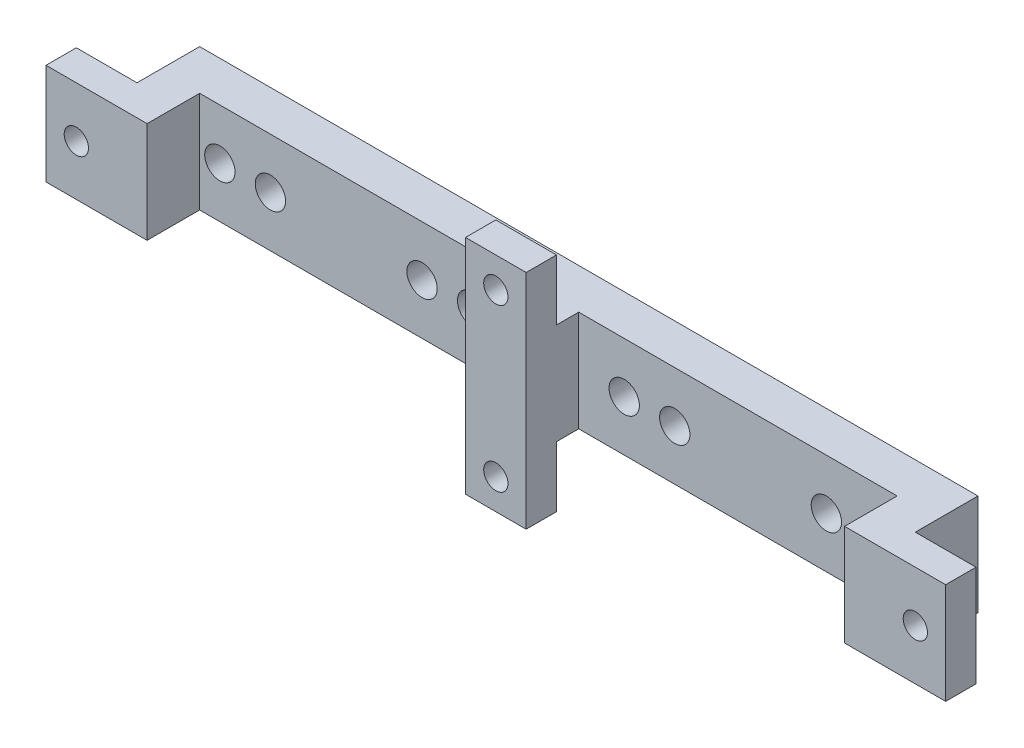
ISO-10303-21;
HEADER;
FILE_DESCRIPTION(('STEP AP214'),'2;1');
FILE_NAME('part.step','',(''),(''),'','','');
FILE_SCHEMA(('AUTOMOTIVE_DESIGN { 1 0 10303 214 1 1 1 1 }'));
ENDSEC;
DATA;
#1=APPLICATION_CONTEXT('core data for automotive mechanical design processes');
#2=APPLICATION_PROTOCOL_DEFINITION('international standard','automotive_design',2000,#1);
#3=PRODUCT_CONTEXT('',#1,'mechanical');
#4=PRODUCT('Part','Part','',(#3));
#5=PRODUCT_RELATED_PRODUCT_CATEGORY('part','',(#4));
#6=PRODUCT_DEFINITION_FORMATION('','',#4);
#7=PRODUCT_DEFINITION_CONTEXT('part definition',#1,'design');
#8=PRODUCT_DEFINITION('design','',#6,#7);
#9=PRODUCT_DEFINITION_SHAPE('','',#8);
#10=(LENGTH_UNIT() NAMED_UNIT(*) SI_UNIT(.MILLI.,.METRE.));
#11=(NAMED_UNIT(*) PLANE_ANGLE_UNIT() SI_UNIT($,.RADIAN.));
#12=(NAMED_UNIT(*) SI_UNIT($,.STERADIAN.) SOLID_ANGLE_UNIT());
#13=UNCERTAINTY_MEASURE_WITH_UNIT(LENGTH_MEASURE(1.E-05),#10,'distance_accuracy_value','');
#14=(GEOMETRIC_REPRESENTATION_CONTEXT(3) GLOBAL_UNCERTAINTY_ASSIGNED_CONTEXT((#13)) GLOBAL_UNIT_ASSIGNED_CONTEXT((#10,
#11,#12)) REPRESENTATION_CONTEXT('',''));
#15=CARTESIAN_POINT('',(0.,0.,0.));
#16=DIRECTION('',(0.,0.,1.));
#17=DIRECTION('',(1.,0.,0.));
#18=AXIS2_PLACEMENT_3D('',#15,#16,#17);
#19=CARTESIAN_POINT('',(0.,0.,2.));
#20=DIRECTION('',(0.,0.,1.));
#21=DIRECTION('',(1.,0.,0.));
#22=AXIS2_PLACEMENT_3D('',#19,#20,#21);
#23=PLANE('',#22);
#24=CARTESIAN_POINT('',(-3.74999999999999,0.,2.));
#25=DIRECTION('',(0.,0.,1.));
#26=DIRECTION('',(1.,0.,0.));
#27=AXIS2_PLACEMENT_3D('',#24,#25,#26);
#28=CIRCLE('',#27,0.75);
#29=CARTESIAN_POINT('',(-2.99999999999999,0.,2.));
#30=VERTEX_POINT('',#29);
#31=EDGE_CURVE('E422',#30,#30,#28,.T.);
#32=ORIENTED_EDGE('',*,*,#31,.F.);
#33=EDGE_LOOP('',(#32));
#34=FACE_BOUND('',#33,.T.);
#35=CARTESIAN_POINT('',(-6.24999999999999,0.,2.));
#36=DIRECTION('',(0.,0.,1.));
#37=DIRECTION('',(1.,0.,0.));
#38=AXIS2_PLACEMENT_3D('',#35,#36,#37);
#39=CIRCLE('',#38,0.749999999999999);
#40=CARTESIAN_POINT('',(-5.49999999999999,0.,2.));
#41=VERTEX_POINT('',#40);
#42=EDGE_CURVE('E416',#41,#41,#39,.T.);
#43=ORIENTED_EDGE('',*,*,#42,.F.);
#44=EDGE_LOOP('',(#43));
#45=FACE_BOUND('',#44,.T.);
#46=CARTESIAN_POINT('',(-13.75,0.,2.));
#47=DIRECTION('',(0.,0.,1.));
#48=DIRECTION('',(1.,0.,0.));
#49=AXIS2_PLACEMENT_3D('',#46,#47,#48);
#50=CIRCLE('',#49,0.75);
#51=CARTESIAN_POINT('',(-13.,0.,2.));
#52=VERTEX_POINT('',#51);
#53=EDGE_CURVE('E410',#52,#52,#50,.T.);
#54=ORIENTED_EDGE('',*,*,#53,.F.);
#55=EDGE_LOOP('',(#54));
#56=FACE_BOUND('',#55,.T.);
#57=CARTESIAN_POINT('',(-16.25,0.,2.));
#58=DIRECTION('',(0.,0.,1.));
#59=DIRECTION('',(1.,0.,0.));
#60=AXIS2_PLACEMENT_3D('',#57,#58,#59);
#61=CIRCLE('',#60,0.750000000000002);
#62=CARTESIAN_POINT('',(-15.5,0.,2.));
#63=VERTEX_POINT('',#62);
#64=EDGE_CURVE('E400',#63,#63,#61,.T.);
#65=ORIENTED_EDGE('',*,*,#64,.F.);
#66=EDGE_LOOP('',(#65));
#67=FACE_BOUND('',#66,.T.);
#68=DIRECTION('',(1.,0.,0.));
#69=VECTOR('',#68,1.);
#70=CARTESIAN_POINT('',(-17.25,-2.5,2.));
#71=LINE('',#70,#69);
#72=CARTESIAN_POINT('',(-17.25,-2.5,2.));
#73=VERTEX_POINT('',#72);
#74=CARTESIAN_POINT('',(-1.5,-2.5,2.));
#75=VERTEX_POINT('',#74);
#76=EDGE_CURVE('E452',#73,#75,#71,.T.);
#77=ORIENTED_EDGE('',*,*,#76,.T.);
#78=DIRECTION('',(0.,1.,0.));
#79=VECTOR('',#78,1.);
#80=CARTESIAN_POINT('',(-1.5,0.,2.));
#81=LINE('',#80,#79);
#82=CARTESIAN_POINT('',(-1.5,2.5,2.));
#83=VERTEX_POINT('',#82);
#84=EDGE_CURVE('E361',#75,#83,#81,.T.);
#85=ORIENTED_EDGE('',*,*,#84,.T.);
#86=DIRECTION('',(1.,0.,0.));
#87=VECTOR('',#86,1.);
#88=CARTESIAN_POINT('',(-17.25,2.5,2.));
#89=LINE('',#88,#87);
#90=CARTESIAN_POINT('',(-17.25,2.5,2.));
#91=VERTEX_POINT('',#90);
#92=EDGE_CURVE('E12',#91,#83,#89,.T.);
#93=ORIENTED_EDGE('',*,*,#92,.F.);
#94=DIRECTION('',(0.,-1.,0.));
#95=VECTOR('',#94,1.);
#96=CARTESIAN_POINT('',(-17.25,2.5,2.));
#97=LINE('',#96,#95);
#98=EDGE_CURVE('E448',#91,#73,#97,.T.);
#99=ORIENTED_EDGE('',*,*,#98,.T.);
#100=EDGE_LOOP('',(#77,#85,#93,#99));
#101=FACE_BOUND('',#100,.T.);
#102=ADVANCED_FACE('F101',(#34,#45,#56,#67,#101),#23,.T.);
#103=CARTESIAN_POINT('',(-17.25,-2.5,2.));
#104=DIRECTION('',(0.,1.,0.));
#105=DIRECTION('',(0.,0.,1.));
#106=AXIS2_PLACEMENT_3D('',#103,#104,#105);
#107=PLANE('',#106);
#108=DIRECTION('',(0.,0.,-1.));
#109=VECTOR('',#108,1.);
#110=CARTESIAN_POINT('',(1.5,-2.5,4.6));
#111=LINE('',#110,#109);
#112=CARTESIAN_POINT('',(1.5,-2.5,3.1));
#113=VERTEX_POINT('',#112);
#114=CARTESIAN_POINT('',(1.5,-2.5,2.));
#115=VERTEX_POINT('',#114);
#116=EDGE_CURVE('E353',#113,#115,#111,.T.);
#117=ORIENTED_EDGE('',*,*,#116,.F.);
#118=DIRECTION('',(-1.,0.,0.));
#119=VECTOR('',#118,1.);
#120=CARTESIAN_POINT('',(0.,-2.5,3.1));
#121=LINE('',#120,#119);
#122=CARTESIAN_POINT('',(-1.5,-2.5,3.1));
#123=VERTEX_POINT('',#122);
#124=EDGE_CURVE('E285',#113,#123,#121,.T.);
#125=ORIENTED_EDGE('',*,*,#124,.T.);
#126=DIRECTION('',(0.,0.,-1.));
#127=VECTOR('',#126,1.);
#128=CARTESIAN_POINT('',(-1.5,-2.5,4.6));
#129=LINE('',#128,#127);
#130=EDGE_CURVE('E355',#123,#75,#129,.T.);
#131=ORIENTED_EDGE('',*,*,#130,.T.);
#132=ORIENTED_EDGE('',*,*,#76,.F.);
#133=DIRECTION('',(0.,0.,-1.));
#134=VECTOR('',#133,1.);
#135=CARTESIAN_POINT('',(-17.25,-2.5,4.6));
#136=LINE('',#135,#134);
#137=CARTESIAN_POINT('',(-17.25,-2.5,4.6));
#138=VERTEX_POINT('',#137);
#139=EDGE_CURVE('E393',#138,#73,#136,.T.);
#140=ORIENTED_EDGE('',*,*,#139,.F.);
#141=DIRECTION('',(-1.,0.,0.));
#142=VECTOR('',#141,1.);
#143=CARTESIAN_POINT('',(0.,-2.5,4.6));
#144=LINE('',#143,#142);
#145=CARTESIAN_POINT('',(-22.25,-2.5,4.6));
#146=VERTEX_POINT('',#145);
#147=EDGE_CURVE('E383',#138,#146,#144,.T.);
#148=ORIENTED_EDGE('',*,*,#147,.T.);
#149=DIRECTION('',(0.,0.,1.));
#150=VECTOR('',#149,1.);
#151=CARTESIAN_POINT('',(-22.25,-2.5,3.1));
#152=LINE('',#151,#150);
#153=CARTESIAN_POINT('',(-22.25,-2.5,3.1));
#154=VERTEX_POINT('',#153);
#155=EDGE_CURVE('E344',#154,#146,#152,.T.);
#156=ORIENTED_EDGE('',*,*,#155,.F.);
#157=DIRECTION('',(1.,0.,0.));
#158=VECTOR('',#157,1.);
#159=CARTESIAN_POINT('',(0.,-2.5,3.1));
#160=LINE('',#159,#158);
#161=CARTESIAN_POINT('',(-19.25,-2.5,3.1));
#162=VERTEX_POINT('',#161);
#163=EDGE_CURVE('E331',#154,#162,#160,.T.);
#164=ORIENTED_EDGE('',*,*,#163,.T.);
#165=DIRECTION('',(0.,0.,-1.));
#166=VECTOR('',#165,1.);
#167=CARTESIAN_POINT('',(-19.25,-2.5,4.6));
#168=LINE('',#167,#166);
#169=CARTESIAN_POINT('',(-19.25,-2.5,0.));
#170=VERTEX_POINT('',#169);
#171=EDGE_CURVE('E395',#162,#170,#168,.T.);
#172=ORIENTED_EDGE('',*,*,#171,.T.);
#173=DIRECTION('',(1.,0.,0.));
#174=VECTOR('',#173,1.);
#175=CARTESIAN_POINT('',(-17.25,-2.5,0.));
#176=LINE('',#175,#174);
#177=CARTESIAN_POINT('',(19.25,-2.5,0.));
#178=VERTEX_POINT('',#177);
#179=EDGE_CURVE('E403',#170,#178,#176,.T.);
#180=ORIENTED_EDGE('',*,*,#179,.T.);
#181=DIRECTION('',(0.,0.,-1.));
#182=VECTOR('',#181,1.);
#183=CARTESIAN_POINT('',(19.25,-2.5,4.6));
#184=LINE('',#183,#182);
#185=CARTESIAN_POINT('',(19.25,-2.5,3.1));
#186=VERTEX_POINT('',#185);
#187=EDGE_CURVE('E373',#186,#178,#184,.T.);
#188=ORIENTED_EDGE('',*,*,#187,.F.);
#189=DIRECTION('',(-1.,0.,0.));
#190=VECTOR('',#189,1.);
#191=CARTESIAN_POINT('',(0.,-2.5,3.1));
#192=LINE('',#191,#190);
#193=CARTESIAN_POINT('',(22.25,-2.5,3.1));
#194=VERTEX_POINT('',#193);
#195=EDGE_CURVE('E257',#194,#186,#192,.T.);
#196=ORIENTED_EDGE('',*,*,#195,.F.);
#197=DIRECTION('',(0.,0.,1.));
#198=VECTOR('',#197,1.);
#199=CARTESIAN_POINT('',(22.25,-2.5,3.1));
#200=LINE('',#199,#198);
#201=CARTESIAN_POINT('',(22.25,-2.5,4.6));
#202=VERTEX_POINT('',#201);
#203=EDGE_CURVE('E264',#194,#202,#200,.T.);
#204=ORIENTED_EDGE('',*,*,#203,.T.);
#205=DIRECTION('',(1.,0.,0.));
#206=VECTOR('',#205,1.);
#207=CARTESIAN_POINT('',(0.,-2.5,4.6));
#208=LINE('',#207,#206);
#209=CARTESIAN_POINT('',(17.25,-2.5,4.6));
#210=VERTEX_POINT('',#209);
#211=EDGE_CURVE('E371',#210,#202,#208,.T.);
#212=ORIENTED_EDGE('',*,*,#211,.F.);
#213=DIRECTION('',(0.,0.,-1.));
#214=VECTOR('',#213,1.);
#215=CARTESIAN_POINT('',(17.25,-2.5,4.6));
#216=LINE('',#215,#214);
#217=CARTESIAN_POINT('',(17.25,-2.5,2.));
#218=VERTEX_POINT('',#217);
#219=EDGE_CURVE('E376',#210,#218,#216,.T.);
#220=ORIENTED_EDGE('',*,*,#219,.T.);
#221=EDGE_CURVE('E451',#115,#218,#71,.T.);
#222=ORIENTED_EDGE('',*,*,#221,.F.);
#223=EDGE_LOOP('',(#117,#125,#131,#132,#140,#148,#156,#164,#172,#180,#188,#196,#204,#212,#220,#222));
#224=FACE_BOUND('',#223,.T.);
#225=ADVANCED_FACE('F103',(#224),#107,.F.);
#226=CARTESIAN_POINT('',(-17.25,2.5,2.));
#227=DIRECTION('',(0.,1.,0.));
#228=DIRECTION('',(0.,0.,1.));
#229=AXIS2_PLACEMENT_3D('',#226,#227,#228);
#230=PLANE('',#229);
#231=DIRECTION('',(-1.,0.,0.));
#232=VECTOR('',#231,1.);
#233=CARTESIAN_POINT('',(0.,2.5,3.1));
#234=LINE('',#233,#232);
#235=CARTESIAN_POINT('',(1.5,2.5,3.1));
#236=VERTEX_POINT('',#235);
#237=CARTESIAN_POINT('',(-1.5,2.5,3.1));
#238=VERTEX_POINT('',#237);
#239=EDGE_CURVE('E305',#236,#238,#234,.T.);
#240=ORIENTED_EDGE('',*,*,#239,.F.);
#241=DIRECTION('',(0.,0.,-1.));
#242=VECTOR('',#241,1.);
#243=CARTESIAN_POINT('',(1.5,2.5,4.6));
#244=LINE('',#243,#242);
#245=CARTESIAN_POINT('',(1.5,2.5,2.));
#246=VERTEX_POINT('',#245);
#247=EDGE_CURVE('E359',#236,#246,#244,.T.);
#248=ORIENTED_EDGE('',*,*,#247,.T.);
#249=CARTESIAN_POINT('',(17.25,2.5,2.));
#250=VERTEX_POINT('',#249);
#251=EDGE_CURVE('E110',#246,#250,#89,.T.);
#252=ORIENTED_EDGE('',*,*,#251,.T.);
#253=DIRECTION('',(0.,0.,-1.));
#254=VECTOR('',#253,1.);
#255=CARTESIAN_POINT('',(17.25,2.5,4.6));
#256=LINE('',#255,#254);
#257=CARTESIAN_POINT('',(17.25,2.5,4.6));
#258=VERTEX_POINT('',#257);
#259=EDGE_CURVE('E247',#258,#250,#256,.T.);
#260=ORIENTED_EDGE('',*,*,#259,.F.);
#261=DIRECTION('',(1.,0.,0.));
#262=VECTOR('',#261,1.);
#263=CARTESIAN_POINT('',(0.,2.5,4.6));
#264=LINE('',#263,#262);
#265=CARTESIAN_POINT('',(22.25,2.5,4.6));
#266=VERTEX_POINT('',#265);
#267=EDGE_CURVE('E367',#258,#266,#264,.T.);
#268=ORIENTED_EDGE('',*,*,#267,.T.);
#269=DIRECTION('',(0.,0.,1.));
#270=VECTOR('',#269,1.);
#271=CARTESIAN_POINT('',(22.25,2.5,3.1));
#272=LINE('',#271,#270);
#273=CARTESIAN_POINT('',(22.25,2.5,3.1));
#274=VERTEX_POINT('',#273);
#275=EDGE_CURVE('E261',#274,#266,#272,.T.);
#276=ORIENTED_EDGE('',*,*,#275,.F.);
#277=DIRECTION('',(-1.,0.,0.));
#278=VECTOR('',#277,1.);
#279=CARTESIAN_POINT('',(0.,2.5,3.1));
#280=LINE('',#279,#278);
#281=CARTESIAN_POINT('',(19.25,2.5,3.1));
#282=VERTEX_POINT('',#281);
#283=EDGE_CURVE('E254',#274,#282,#280,.T.);
#284=ORIENTED_EDGE('',*,*,#283,.T.);
#285=DIRECTION('',(0.,0.,-1.));
#286=VECTOR('',#285,1.);
#287=CARTESIAN_POINT('',(19.25,2.5,4.6));
#288=LINE('',#287,#286);
#289=CARTESIAN_POINT('',(19.25,2.5,0.));
#290=VERTEX_POINT('',#289);
#291=EDGE_CURVE('E238',#282,#290,#288,.T.);
#292=ORIENTED_EDGE('',*,*,#291,.T.);
#293=DIRECTION('',(1.,0.,0.));
#294=VECTOR('',#293,1.);
#295=CARTESIAN_POINT('',(-17.25,2.5,0.));
#296=LINE('',#295,#294);
#297=CARTESIAN_POINT('',(-19.25,2.5,0.));
#298=VERTEX_POINT('',#297);
#299=EDGE_CURVE('E105',#298,#290,#296,.T.);
#300=ORIENTED_EDGE('',*,*,#299,.F.);
#301=DIRECTION('',(0.,0.,-1.));
#302=VECTOR('',#301,1.);
#303=CARTESIAN_POINT('',(-19.25,2.5,4.6));
#304=LINE('',#303,#302);
#305=CARTESIAN_POINT('',(-19.25,2.5,3.1));
#306=VERTEX_POINT('',#305);
#307=EDGE_CURVE('E397',#306,#298,#304,.T.);
#308=ORIENTED_EDGE('',*,*,#307,.F.);
#309=DIRECTION('',(1.,0.,0.));
#310=VECTOR('',#309,1.);
#311=CARTESIAN_POINT('',(0.,2.5,3.1));
#312=LINE('',#311,#310);
#313=CARTESIAN_POINT('',(-22.25,2.5,3.1));
#314=VERTEX_POINT('',#313);
#315=EDGE_CURVE('E337',#314,#306,#312,.T.);
#316=ORIENTED_EDGE('',*,*,#315,.F.);
#317=DIRECTION('',(0.,0.,1.));
#318=VECTOR('',#317,1.);
#319=CARTESIAN_POINT('',(-22.25,2.5,3.1));
#320=LINE('',#319,#318);
#321=CARTESIAN_POINT('',(-22.25,2.5,4.6));
#322=VERTEX_POINT('',#321);
#323=EDGE_CURVE('E341',#314,#322,#320,.T.);
#324=ORIENTED_EDGE('',*,*,#323,.T.);
#325=DIRECTION('',(-1.,0.,0.));
#326=VECTOR('',#325,1.);
#327=CARTESIAN_POINT('',(0.,2.5,4.6));
#328=LINE('',#327,#326);
#329=CARTESIAN_POINT('',(-17.25,2.5,4.6));
#330=VERTEX_POINT('',#329);
#331=EDGE_CURVE('E381',#330,#322,#328,.T.);
#332=ORIENTED_EDGE('',*,*,#331,.F.);
#333=DIRECTION('',(0.,0.,-1.));
#334=VECTOR('',#333,1.);
#335=CARTESIAN_POINT('',(-17.25,2.5,4.6));
#336=LINE('',#335,#334);
#337=EDGE_CURVE('E388',#330,#91,#336,.T.);
#338=ORIENTED_EDGE('',*,*,#337,.T.);
#339=ORIENTED_EDGE('',*,*,#92,.T.);
#340=DIRECTION('',(0.,0.,-1.));
#341=VECTOR('',#340,1.);
#342=CARTESIAN_POINT('',(-1.5,2.5,4.6));
#343=LINE('',#342,#341);
#344=EDGE_CURVE('E357',#238,#83,#343,.T.);
#345=ORIENTED_EDGE('',*,*,#344,.F.);
#346=EDGE_LOOP('',(#240,#248,#252,#260,#268,#276,#284,#292,#300,#308,#316,#324,#332,#338,#339,#345));
#347=FACE_BOUND('',#346,.T.);
#348=ADVANCED_FACE('F259',(#347),#230,.T.);
#349=DIRECTION('',(0.,1.,0.));
#350=VECTOR('',#349,1.);
#351=CARTESIAN_POINT('',(1.5,0.,2.));
#352=LINE('',#351,#350);
#353=EDGE_CURVE('E364',#115,#246,#352,.T.);
#354=ORIENTED_EDGE('',*,*,#353,.F.);
#355=ORIENTED_EDGE('',*,*,#221,.T.);
#356=DIRECTION('',(0.,-1.,0.));
#357=VECTOR('',#356,1.);
#358=CARTESIAN_POINT('',(17.25,2.5,2.));
#359=LINE('',#358,#357);
#360=EDGE_CURVE('E455',#250,#218,#359,.T.);
#361=ORIENTED_EDGE('',*,*,#360,.F.);
#362=ORIENTED_EDGE('',*,*,#251,.F.);
#363=EDGE_LOOP('',(#354,#355,#361,#362));
#364=FACE_BOUND('',#363,.T.);
#365=CARTESIAN_POINT('',(3.74999999999999,0.,2.));
#366=DIRECTION('',(0.,0.,1.));
#367=DIRECTION('',(1.,0.,0.));
#368=AXIS2_PLACEMENT_3D('',#365,#366,#367);
#369=CIRCLE('',#368,0.749999999999999);
#370=CARTESIAN_POINT('',(4.49999999999999,0.,2.));
#371=VERTEX_POINT('',#370);
#372=EDGE_CURVE('E428',#371,#371,#369,.T.);
#373=ORIENTED_EDGE('',*,*,#372,.F.);
#374=EDGE_LOOP('',(#373));
#375=FACE_BOUND('',#374,.T.);
#376=CARTESIAN_POINT('',(6.24999999999999,0.,2.));
#377=DIRECTION('',(0.,0.,1.));
#378=DIRECTION('',(1.,0.,0.));
#379=AXIS2_PLACEMENT_3D('',#376,#377,#378);
#380=CIRCLE('',#379,0.749999999999999);
#381=CARTESIAN_POINT('',(6.99999999999999,0.,2.));
#382=VERTEX_POINT('',#381);
#383=EDGE_CURVE('E434',#382,#382,#380,.T.);
#384=ORIENTED_EDGE('',*,*,#383,.F.);
#385=EDGE_LOOP('',(#384));
#386=FACE_BOUND('',#385,.T.);
#387=CARTESIAN_POINT('',(13.75,0.,2.));
#388=DIRECTION('',(0.,0.,1.));
#389=DIRECTION('',(1.,0.,0.));
#390=AXIS2_PLACEMENT_3D('',#387,#388,#389);
#391=CIRCLE('',#390,0.75);
#392=CARTESIAN_POINT('',(14.5,0.,2.));
#393=VERTEX_POINT('',#392);
#394=EDGE_CURVE('E440',#393,#393,#391,.T.);
#395=ORIENTED_EDGE('',*,*,#394,.F.);
#396=EDGE_LOOP('',(#395));
#397=FACE_BOUND('',#396,.T.);
#398=CARTESIAN_POINT('',(16.25,0.,2.));
#399=DIRECTION('',(0.,0.,1.));
#400=DIRECTION('',(1.,0.,0.));
#401=AXIS2_PLACEMENT_3D('',#398,#399,#400);
#402=CIRCLE('',#401,0.750000000000002);
#403=CARTESIAN_POINT('',(17.,0.,2.));
#404=VERTEX_POINT('',#403);
#405=EDGE_CURVE('E399',#404,#404,#402,.T.);
#406=ORIENTED_EDGE('',*,*,#405,.F.);
#407=EDGE_LOOP('',(#406));
#408=FACE_BOUND('',#407,.T.);
#409=ADVANCED_FACE('F506',(#364,#375,#386,#397,#408),#23,.T.);
#410=CARTESIAN_POINT('',(0.,0.,0.));
#411=DIRECTION('',(0.,0.,1.));
#412=DIRECTION('',(1.,0.,0.));
#413=AXIS2_PLACEMENT_3D('',#410,#411,#412);
#414=PLANE('',#413);
#415=CARTESIAN_POINT('',(3.74999999999999,0.,0.));
#416=DIRECTION('',(0.,0.,1.));
#417=DIRECTION('',(1.,0.,0.));
#418=AXIS2_PLACEMENT_3D('',#415,#416,#417);
#419=CIRCLE('',#418,0.749999999999999);
#420=CARTESIAN_POINT('',(4.49999999999999,0.,0.));
#421=VERTEX_POINT('',#420);
#422=EDGE_CURVE('E425',#421,#421,#419,.T.);
#423=ORIENTED_EDGE('',*,*,#422,.T.);
#424=EDGE_LOOP('',(#423));
#425=FACE_BOUND('',#424,.T.);
#426=CARTESIAN_POINT('',(6.24999999999999,0.,0.));
#427=DIRECTION('',(0.,0.,1.));
#428=DIRECTION('',(1.,0.,0.));
#429=AXIS2_PLACEMENT_3D('',#426,#427,#428);
#430=CIRCLE('',#429,0.749999999999999);
#431=CARTESIAN_POINT('',(6.99999999999999,0.,0.));
#432=VERTEX_POINT('',#431);
#433=EDGE_CURVE('E431',#432,#432,#430,.T.);
#434=ORIENTED_EDGE('',*,*,#433,.T.);
#435=EDGE_LOOP('',(#434));
#436=FACE_BOUND('',#435,.T.);
#437=CARTESIAN_POINT('',(13.75,0.,0.));
#438=DIRECTION('',(0.,0.,1.));
#439=DIRECTION('',(1.,0.,0.));
#440=AXIS2_PLACEMENT_3D('',#437,#438,#439);
#441=CIRCLE('',#440,0.75);
#442=CARTESIAN_POINT('',(14.5,0.,0.));
#443=VERTEX_POINT('',#442);
#444=EDGE_CURVE('E437',#443,#443,#441,.T.);
#445=ORIENTED_EDGE('',*,*,#444,.T.);
#446=EDGE_LOOP('',(#445));
#447=FACE_BOUND('',#446,.T.);
#448=CARTESIAN_POINT('',(16.25,0.,0.));
#449=DIRECTION('',(0.,0.,1.));
#450=DIRECTION('',(1.,0.,0.));
#451=AXIS2_PLACEMENT_3D('',#448,#449,#450);
#452=CIRCLE('',#451,0.750000000000002);
#453=CARTESIAN_POINT('',(17.,0.,0.));
#454=VERTEX_POINT('',#453);
#455=EDGE_CURVE('E443',#454,#454,#452,.T.);
#456=ORIENTED_EDGE('',*,*,#455,.T.);
#457=EDGE_LOOP('',(#456));
#458=FACE_BOUND('',#457,.T.);
#459=DIRECTION('',(0.,-1.,0.));
#460=VECTOR('',#459,1.);
#461=CARTESIAN_POINT('',(19.25,0.,0.));
#462=LINE('',#461,#460);
#463=EDGE_CURVE('E241',#290,#178,#462,.T.);
#464=ORIENTED_EDGE('',*,*,#463,.T.);
#465=ORIENTED_EDGE('',*,*,#179,.F.);
#466=DIRECTION('',(0.,-1.,0.));
#467=VECTOR('',#466,1.);
#468=CARTESIAN_POINT('',(-19.25,0.,0.));
#469=LINE('',#468,#467);
#470=EDGE_CURVE('E246',#298,#170,#469,.T.);
#471=ORIENTED_EDGE('',*,*,#470,.F.);
#472=ORIENTED_EDGE('',*,*,#299,.T.);
#473=EDGE_LOOP('',(#464,#465,#471,#472));
#474=FACE_BOUND('',#473,.T.);
#475=CARTESIAN_POINT('',(-3.74999999999999,0.,0.));
#476=DIRECTION('',(0.,0.,1.));
#477=DIRECTION('',(1.,0.,0.));
#478=AXIS2_PLACEMENT_3D('',#475,#476,#477);
#479=CIRCLE('',#478,0.75);
#480=CARTESIAN_POINT('',(-2.99999999999999,0.,0.));
#481=VERTEX_POINT('',#480);
#482=EDGE_CURVE('E419',#481,#481,#479,.T.);
#483=ORIENTED_EDGE('',*,*,#482,.T.);
#484=EDGE_LOOP('',(#483));
#485=FACE_BOUND('',#484,.T.);
#486=CARTESIAN_POINT('',(-6.24999999999999,0.,0.));
#487=DIRECTION('',(0.,0.,1.));
#488=DIRECTION('',(1.,0.,0.));
#489=AXIS2_PLACEMENT_3D('',#486,#487,#488);
#490=CIRCLE('',#489,0.749999999999999);
#491=CARTESIAN_POINT('',(-5.49999999999999,0.,0.));
#492=VERTEX_POINT('',#491);
#493=EDGE_CURVE('E413',#492,#492,#490,.T.);
#494=ORIENTED_EDGE('',*,*,#493,.T.);
#495=EDGE_LOOP('',(#494));
#496=FACE_BOUND('',#495,.T.);
#497=CARTESIAN_POINT('',(-13.75,0.,0.));
#498=DIRECTION('',(0.,0.,1.));
#499=DIRECTION('',(1.,0.,0.));
#500=AXIS2_PLACEMENT_3D('',#497,#498,#499);
#501=CIRCLE('',#500,0.75);
#502=CARTESIAN_POINT('',(-13.,0.,0.));
#503=VERTEX_POINT('',#502);
#504=EDGE_CURVE('E407',#503,#503,#501,.T.);
#505=ORIENTED_EDGE('',*,*,#504,.T.);
#506=EDGE_LOOP('',(#505));
#507=FACE_BOUND('',#506,.T.);
#508=CARTESIAN_POINT('',(-16.25,0.,0.));
#509=DIRECTION('',(0.,0.,1.));
#510=DIRECTION('',(1.,0.,0.));
#511=AXIS2_PLACEMENT_3D('',#508,#509,#510);
#512=CIRCLE('',#511,0.750000000000002);
#513=CARTESIAN_POINT('',(-15.5,0.,0.));
#514=VERTEX_POINT('',#513);
#515=EDGE_CURVE('E404',#514,#514,#512,.T.);
#516=ORIENTED_EDGE('',*,*,#515,.T.);
#517=EDGE_LOOP('',(#516));
#518=FACE_BOUND('',#517,.T.);
#519=ADVANCED_FACE('F462',(#425,#436,#447,#458,#474,#485,#496,#507,#518),#414,.F.);
#520=CARTESIAN_POINT('',(16.25,0.,2.));
#521=DIRECTION('',(0.,0.,-1.));
#522=DIRECTION('',(-1.,0.,0.));
#523=AXIS2_PLACEMENT_3D('',#520,#521,#522);
#524=CYLINDRICAL_SURFACE('',#523,0.750000000000002);
#525=ORIENTED_EDGE('',*,*,#405,.T.);
#526=EDGE_LOOP('',(#525));
#527=FACE_BOUND('',#526,.T.);
#528=ORIENTED_EDGE('',*,*,#455,.F.);
#529=EDGE_LOOP('',(#528));
#530=FACE_BOUND('',#529,.T.);
#531=ADVANCED_FACE('F558',(#527,#530),#524,.F.);
#532=CARTESIAN_POINT('',(13.75,0.,2.));
#533=DIRECTION('',(0.,0.,-1.));
#534=DIRECTION('',(-1.,0.,0.));
#535=AXIS2_PLACEMENT_3D('',#532,#533,#534);
#536=CYLINDRICAL_SURFACE('',#535,0.75);
#537=ORIENTED_EDGE('',*,*,#394,.T.);
#538=EDGE_LOOP('',(#537));
#539=FACE_BOUND('',#538,.T.);
#540=ORIENTED_EDGE('',*,*,#444,.F.);
#541=EDGE_LOOP('',(#540));
#542=FACE_BOUND('',#541,.T.);
#543=ADVANCED_FACE('F675',(#539,#542),#536,.F.);
#544=CARTESIAN_POINT('',(6.24999999999999,0.,2.));
#545=DIRECTION('',(0.,0.,-1.));
#546=DIRECTION('',(-1.,0.,0.));
#547=AXIS2_PLACEMENT_3D('',#544,#545,#546);
#548=CYLINDRICAL_SURFACE('',#547,0.749999999999999);
#549=ORIENTED_EDGE('',*,*,#383,.T.);
#550=EDGE_LOOP('',(#549));
#551=FACE_BOUND('',#550,.T.);
#552=ORIENTED_EDGE('',*,*,#433,.F.);
#553=EDGE_LOOP('',(#552));
#554=FACE_BOUND('',#553,.T.);
#555=ADVANCED_FACE('F664',(#551,#554),#548,.F.);
#556=CARTESIAN_POINT('',(3.74999999999999,0.,2.));
#557=DIRECTION('',(0.,0.,-1.));
#558=DIRECTION('',(-1.,0.,0.));
#559=AXIS2_PLACEMENT_3D('',#556,#557,#558);
#560=CYLINDRICAL_SURFACE('',#559,0.749999999999999);
#561=ORIENTED_EDGE('',*,*,#372,.T.);
#562=EDGE_LOOP('',(#561));
#563=FACE_BOUND('',#562,.T.);
#564=ORIENTED_EDGE('',*,*,#422,.F.);
#565=EDGE_LOOP('',(#564));
#566=FACE_BOUND('',#565,.T.);
#567=ADVANCED_FACE('F653',(#563,#566),#560,.F.);
#568=CARTESIAN_POINT('',(-3.74999999999999,0.,2.));
#569=DIRECTION('',(0.,0.,-1.));
#570=DIRECTION('',(-1.,0.,0.));
#571=AXIS2_PLACEMENT_3D('',#568,#569,#570);
#572=CYLINDRICAL_SURFACE('',#571,0.75);
#573=ORIENTED_EDGE('',*,*,#31,.T.);
#574=EDGE_LOOP('',(#573));
#575=FACE_BOUND('',#574,.T.);
#576=ORIENTED_EDGE('',*,*,#482,.F.);
#577=EDGE_LOOP('',(#576));
#578=FACE_BOUND('',#577,.T.);
#579=ADVANCED_FACE('F642',(#575,#578),#572,.F.);
#580=CARTESIAN_POINT('',(-6.24999999999999,0.,2.));
#581=DIRECTION('',(0.,0.,-1.));
#582=DIRECTION('',(-1.,0.,0.));
#583=AXIS2_PLACEMENT_3D('',#580,#581,#582);
#584=CYLINDRICAL_SURFACE('',#583,0.749999999999999);
#585=ORIENTED_EDGE('',*,*,#42,.T.);
#586=EDGE_LOOP('',(#585));
#587=FACE_BOUND('',#586,.T.);
#588=ORIENTED_EDGE('',*,*,#493,.F.);
#589=EDGE_LOOP('',(#588));
#590=FACE_BOUND('',#589,.T.);
#591=ADVANCED_FACE('F631',(#587,#590),#584,.F.);
#592=CARTESIAN_POINT('',(-13.75,0.,2.));
#593=DIRECTION('',(0.,0.,-1.));
#594=DIRECTION('',(-1.,0.,0.));
#595=AXIS2_PLACEMENT_3D('',#592,#593,#594);
#596=CYLINDRICAL_SURFACE('',#595,0.75);
#597=ORIENTED_EDGE('',*,*,#53,.T.);
#598=EDGE_LOOP('',(#597));
#599=FACE_BOUND('',#598,.T.);
#600=ORIENTED_EDGE('',*,*,#504,.F.);
#601=EDGE_LOOP('',(#600));
#602=FACE_BOUND('',#601,.T.);
#603=ADVANCED_FACE('F621',(#599,#602),#596,.F.);
#604=CARTESIAN_POINT('',(-16.25,0.,2.));
#605=DIRECTION('',(0.,0.,-1.));
#606=DIRECTION('',(-1.,0.,0.));
#607=AXIS2_PLACEMENT_3D('',#604,#605,#606);
#608=CYLINDRICAL_SURFACE('',#607,0.750000000000002);
#609=ORIENTED_EDGE('',*,*,#64,.T.);
#610=EDGE_LOOP('',(#609));
#611=FACE_BOUND('',#610,.T.);
#612=ORIENTED_EDGE('',*,*,#515,.F.);
#613=EDGE_LOOP('',(#612));
#614=FACE_BOUND('',#613,.T.);
#615=ADVANCED_FACE('F588',(#611,#614),#608,.F.);
#616=CARTESIAN_POINT('',(-17.25,0.,4.6));
#617=DIRECTION('',(1.,0.,0.));
#618=DIRECTION('',(0.,1.,0.));
#619=AXIS2_PLACEMENT_3D('',#616,#617,#618);
#620=PLANE('',#619);
#621=ORIENTED_EDGE('',*,*,#98,.F.);
#622=ORIENTED_EDGE('',*,*,#337,.F.);
#623=DIRECTION('',(0.,-1.,0.));
#624=VECTOR('',#623,1.);
#625=CARTESIAN_POINT('',(-17.25,0.,4.6));
#626=LINE('',#625,#624);
#627=EDGE_CURVE('E385',#330,#138,#626,.T.);
#628=ORIENTED_EDGE('',*,*,#627,.T.);
#629=ORIENTED_EDGE('',*,*,#139,.T.);
#630=EDGE_LOOP('',(#621,#622,#628,#629));
#631=FACE_BOUND('',#630,.T.);
#632=ADVANCED_FACE('F486',(#631),#620,.T.);
#633=CARTESIAN_POINT('',(-19.25,0.,4.6));
#634=DIRECTION('',(1.,0.,0.));
#635=DIRECTION('',(0.,0.,-1.));
#636=AXIS2_PLACEMENT_3D('',#633,#634,#635);
#637=PLANE('',#636);
#638=ORIENTED_EDGE('',*,*,#171,.F.);
#639=DIRECTION('',(0.,1.,0.));
#640=VECTOR('',#639,1.);
#641=CARTESIAN_POINT('',(-19.25,0.,3.1));
#642=LINE('',#641,#640);
#643=EDGE_CURVE('E334',#162,#306,#642,.T.);
#644=ORIENTED_EDGE('',*,*,#643,.T.);
#645=ORIENTED_EDGE('',*,*,#307,.T.);
#646=ORIENTED_EDGE('',*,*,#470,.T.);
#647=EDGE_LOOP('',(#638,#644,#645,#646));
#648=FACE_BOUND('',#647,.T.);
#649=ADVANCED_FACE('F468',(#648),#637,.F.);
#650=CARTESIAN_POINT('',(0.,0.,4.6));
#651=DIRECTION('',(0.,0.,1.));
#652=DIRECTION('',(1.,0.,0.));
#653=AXIS2_PLACEMENT_3D('',#650,#651,#652);
#654=PLANE('',#653);
#655=ORIENTED_EDGE('',*,*,#331,.T.);
#656=DIRECTION('',(0.,1.,0.));
#657=VECTOR('',#656,1.);
#658=CARTESIAN_POINT('',(-22.25,0.,4.6));
#659=LINE('',#658,#657);
#660=EDGE_CURVE('E328',#146,#322,#659,.T.);
#661=ORIENTED_EDGE('',*,*,#660,.F.);
#662=ORIENTED_EDGE('',*,*,#147,.F.);
#663=ORIENTED_EDGE('',*,*,#627,.F.);
#664=EDGE_LOOP('',(#655,#661,#662,#663));
#665=FACE_BOUND('',#664,.T.);
#666=CARTESIAN_POINT('',(-20.75,0.,4.6));
#667=DIRECTION('',(0.,0.,1.));
#668=DIRECTION('',(1.,0.,0.));
#669=AXIS2_PLACEMENT_3D('',#666,#667,#668);
#670=CIRCLE('',#669,0.6);
#671=CARTESIAN_POINT('',(-20.15,0.,4.6));
#672=VERTEX_POINT('',#671);
#673=EDGE_CURVE('E324',#672,#672,#670,.T.);
#674=ORIENTED_EDGE('',*,*,#673,.F.);
#675=EDGE_LOOP('',(#674));
#676=FACE_BOUND('',#675,.T.);
#677=ADVANCED_FACE('F483',(#665,#676),#654,.T.);
#678=CARTESIAN_POINT('',(17.25,0.,4.6));
#679=DIRECTION('',(1.,0.,0.));
#680=DIRECTION('',(0.,0.,-1.));
#681=AXIS2_PLACEMENT_3D('',#678,#679,#680);
#682=PLANE('',#681);
#683=ORIENTED_EDGE('',*,*,#259,.T.);
#684=ORIENTED_EDGE('',*,*,#360,.T.);
#685=ORIENTED_EDGE('',*,*,#219,.F.);
#686=DIRECTION('',(0.,-1.,0.));
#687=VECTOR('',#686,1.);
#688=CARTESIAN_POINT('',(17.25,0.,4.6));
#689=LINE('',#688,#687);
#690=EDGE_CURVE('E369',#258,#210,#689,.T.);
#691=ORIENTED_EDGE('',*,*,#690,.F.);
#692=EDGE_LOOP('',(#683,#684,#685,#691));
#693=FACE_BOUND('',#692,.T.);
#694=ADVANCED_FACE('F512',(#693),#682,.F.);
#695=CARTESIAN_POINT('',(19.25,0.,4.6));
#696=DIRECTION('',(1.,0.,0.));
#697=DIRECTION('',(0.,0.,-1.));
#698=AXIS2_PLACEMENT_3D('',#695,#696,#697);
#699=PLANE('',#698);
#700=DIRECTION('',(0.,1.,0.));
#701=VECTOR('',#700,1.);
#702=CARTESIAN_POINT('',(19.25,0.,3.1));
#703=LINE('',#702,#701);
#704=EDGE_CURVE('E118',#186,#282,#703,.T.);
#705=ORIENTED_EDGE('',*,*,#704,.F.);
#706=ORIENTED_EDGE('',*,*,#187,.T.);
#707=ORIENTED_EDGE('',*,*,#463,.F.);
#708=ORIENTED_EDGE('',*,*,#291,.F.);
#709=EDGE_LOOP('',(#705,#706,#707,#708));
#710=FACE_BOUND('',#709,.T.);
#711=ADVANCED_FACE('F239',(#710),#699,.T.);
#712=CARTESIAN_POINT('',(0.,0.,4.6));
#713=DIRECTION('',(0.,0.,1.));
#714=DIRECTION('',(1.,0.,0.));
#715=AXIS2_PLACEMENT_3D('',#712,#713,#714);
#716=PLANE('',#715);
#717=ORIENTED_EDGE('',*,*,#211,.T.);
#718=DIRECTION('',(0.,1.,0.));
#719=VECTOR('',#718,1.);
#720=CARTESIAN_POINT('',(22.25,0.,4.6));
#721=LINE('',#720,#719);
#722=EDGE_CURVE('E268',#202,#266,#721,.T.);
#723=ORIENTED_EDGE('',*,*,#722,.T.);
#724=ORIENTED_EDGE('',*,*,#267,.F.);
#725=ORIENTED_EDGE('',*,*,#690,.T.);
#726=EDGE_LOOP('',(#717,#723,#724,#725));
#727=FACE_BOUND('',#726,.T.);
#728=CARTESIAN_POINT('',(20.75,0.,4.6));
#729=DIRECTION('',(0.,0.,1.));
#730=DIRECTION('',(1.,0.,0.));
#731=AXIS2_PLACEMENT_3D('',#728,#729,#730);
#732=CIRCLE('',#731,0.6);
#733=CARTESIAN_POINT('',(21.35,0.,4.6));
#734=VERTEX_POINT('',#733);
#735=EDGE_CURVE('E522',#734,#734,#732,.T.);
#736=ORIENTED_EDGE('',*,*,#735,.F.);
#737=EDGE_LOOP('',(#736));
#738=FACE_BOUND('',#737,.T.);
#739=ADVANCED_FACE('F518',(#727,#738),#716,.T.);
#740=CARTESIAN_POINT('',(1.5,0.,4.6));
#741=DIRECTION('',(1.,0.,0.));
#742=DIRECTION('',(0.,0.,-1.));
#743=AXIS2_PLACEMENT_3D('',#740,#741,#742);
#744=PLANE('',#743);
#745=DIRECTION('',(0.,-1.,0.));
#746=VECTOR('',#745,1.);
#747=CARTESIAN_POINT('',(1.5,0.,4.6));
#748=LINE('',#747,#746);
#749=CARTESIAN_POINT('',(1.5,5.5,4.6));
#750=VERTEX_POINT('',#749);
#751=CARTESIAN_POINT('',(1.5,-5.5,4.6));
#752=VERTEX_POINT('',#751);
#753=EDGE_CURVE('E347',#750,#752,#748,.T.);
#754=ORIENTED_EDGE('',*,*,#753,.T.);
#755=DIRECTION('',(0.,0.,1.));
#756=VECTOR('',#755,1.);
#757=CARTESIAN_POINT('',(1.5,-5.5,3.1));
#758=LINE('',#757,#756);
#759=CARTESIAN_POINT('',(1.5,-5.5,3.1));
#760=VERTEX_POINT('',#759);
#761=EDGE_CURVE('E290',#760,#752,#758,.T.);
#762=ORIENTED_EDGE('',*,*,#761,.F.);
#763=DIRECTION('',(0.,1.,0.));
#764=VECTOR('',#763,1.);
#765=CARTESIAN_POINT('',(1.5,0.,3.1));
#766=LINE('',#765,#764);
#767=EDGE_CURVE('E287',#760,#113,#766,.T.);
#768=ORIENTED_EDGE('',*,*,#767,.T.);
#769=ORIENTED_EDGE('',*,*,#116,.T.);
#770=ORIENTED_EDGE('',*,*,#353,.T.);
#771=ORIENTED_EDGE('',*,*,#247,.F.);
#772=DIRECTION('',(0.,1.,0.));
#773=VECTOR('',#772,1.);
#774=CARTESIAN_POINT('',(1.5,0.,3.1));
#775=LINE('',#774,#773);
#776=CARTESIAN_POINT('',(1.5,5.5,3.1));
#777=VERTEX_POINT('',#776);
#778=EDGE_CURVE('E313',#236,#777,#775,.T.);
#779=ORIENTED_EDGE('',*,*,#778,.T.);
#780=DIRECTION('',(0.,0.,1.));
#781=VECTOR('',#780,1.);
#782=CARTESIAN_POINT('',(1.5,5.5,3.1));
#783=LINE('',#782,#781);
#784=EDGE_CURVE('E316',#777,#750,#783,.T.);
#785=ORIENTED_EDGE('',*,*,#784,.T.);
#786=EDGE_LOOP('',(#754,#762,#768,#769,#770,#771,#779,#785));
#787=FACE_BOUND('',#786,.T.);
#788=ADVANCED_FACE('F500',(#787),#744,.T.);
#789=CARTESIAN_POINT('',(-1.5,0.,4.6));
#790=DIRECTION('',(1.,0.,0.));
#791=DIRECTION('',(0.,0.,-1.));
#792=AXIS2_PLACEMENT_3D('',#789,#790,#791);
#793=PLANE('',#792);
#794=ORIENTED_EDGE('',*,*,#84,.F.);
#795=ORIENTED_EDGE('',*,*,#130,.F.);
#796=DIRECTION('',(0.,1.,0.));
#797=VECTOR('',#796,1.);
#798=CARTESIAN_POINT('',(-1.5,0.,3.1));
#799=LINE('',#798,#797);
#800=CARTESIAN_POINT('',(-1.5,-5.5,3.1));
#801=VERTEX_POINT('',#800);
#802=EDGE_CURVE('E126',#801,#123,#799,.T.);
#803=ORIENTED_EDGE('',*,*,#802,.F.);
#804=DIRECTION('',(0.,0.,1.));
#805=VECTOR('',#804,1.);
#806=CARTESIAN_POINT('',(-1.5,-5.5,3.1));
#807=LINE('',#806,#805);
#808=CARTESIAN_POINT('',(-1.5,-5.5,4.6));
#809=VERTEX_POINT('',#808);
#810=EDGE_CURVE('E295',#801,#809,#807,.T.);
#811=ORIENTED_EDGE('',*,*,#810,.T.);
#812=DIRECTION('',(0.,-1.,0.));
#813=VECTOR('',#812,1.);
#814=CARTESIAN_POINT('',(-1.5,0.,4.6));
#815=LINE('',#814,#813);
#816=CARTESIAN_POINT('',(-1.5,5.5,4.6));
#817=VERTEX_POINT('',#816);
#818=EDGE_CURVE('E351',#817,#809,#815,.T.);
#819=ORIENTED_EDGE('',*,*,#818,.F.);
#820=DIRECTION('',(0.,0.,1.));
#821=VECTOR('',#820,1.);
#822=CARTESIAN_POINT('',(-1.5,5.5,3.1));
#823=LINE('',#822,#821);
#824=CARTESIAN_POINT('',(-1.5,5.5,3.1));
#825=VERTEX_POINT('',#824);
#826=EDGE_CURVE('E321',#825,#817,#823,.T.);
#827=ORIENTED_EDGE('',*,*,#826,.F.);
#828=DIRECTION('',(0.,1.,0.));
#829=VECTOR('',#828,1.);
#830=CARTESIAN_POINT('',(-1.5,0.,3.1));
#831=LINE('',#830,#829);
#832=EDGE_CURVE('E308',#238,#825,#831,.T.);
#833=ORIENTED_EDGE('',*,*,#832,.F.);
#834=ORIENTED_EDGE('',*,*,#344,.T.);
#835=EDGE_LOOP('',(#794,#795,#803,#811,#819,#827,#833,#834));
#836=FACE_BOUND('',#835,.T.);
#837=ADVANCED_FACE('F494',(#836),#793,.F.);
#838=CARTESIAN_POINT('',(0.,0.,4.6));
#839=DIRECTION('',(0.,0.,1.));
#840=DIRECTION('',(1.,0.,0.));
#841=AXIS2_PLACEMENT_3D('',#838,#839,#840);
#842=PLANE('',#841);
#843=ORIENTED_EDGE('',*,*,#753,.F.);
#844=DIRECTION('',(-1.,0.,0.));
#845=VECTOR('',#844,1.);
#846=CARTESIAN_POINT('',(0.,5.5,4.6));
#847=LINE('',#846,#845);
#848=EDGE_CURVE('E302',#750,#817,#847,.T.);
#849=ORIENTED_EDGE('',*,*,#848,.T.);
#850=ORIENTED_EDGE('',*,*,#818,.T.);
#851=DIRECTION('',(-1.,0.,0.));
#852=VECTOR('',#851,1.);
#853=CARTESIAN_POINT('',(0.,-5.5,4.6));
#854=LINE('',#853,#852);
#855=EDGE_CURVE('E279',#752,#809,#854,.T.);
#856=ORIENTED_EDGE('',*,*,#855,.F.);
#857=EDGE_LOOP('',(#843,#849,#850,#856));
#858=FACE_BOUND('',#857,.T.);
#859=CARTESIAN_POINT('',(0.,4.,4.6));
#860=DIRECTION('',(0.,0.,1.));
#861=DIRECTION('',(1.,0.,0.));
#862=AXIS2_PLACEMENT_3D('',#859,#860,#861);
#863=CIRCLE('',#862,0.6);
#864=CARTESIAN_POINT('',(0.6,4.,4.6));
#865=VERTEX_POINT('',#864);
#866=EDGE_CURVE('E298',#865,#865,#863,.T.);
#867=ORIENTED_EDGE('',*,*,#866,.F.);
#868=EDGE_LOOP('',(#867));
#869=FACE_BOUND('',#868,.T.);
#870=CARTESIAN_POINT('',(0.,-4.,4.6));
#871=DIRECTION('',(0.,0.,1.));
#872=DIRECTION('',(1.,0.,0.));
#873=AXIS2_PLACEMENT_3D('',#870,#871,#872);
#874=CIRCLE('',#873,0.6);
#875=CARTESIAN_POINT('',(0.6,-4.,4.6));
#876=VERTEX_POINT('',#875);
#877=EDGE_CURVE('E275',#876,#876,#874,.T.);
#878=ORIENTED_EDGE('',*,*,#877,.F.);
#879=EDGE_LOOP('',(#878));
#880=FACE_BOUND('',#879,.T.);
#881=ADVANCED_FACE('F757',(#858,#869,#880),#842,.T.);
#882=CARTESIAN_POINT('',(-22.25,0.,3.1));
#883=DIRECTION('',(1.,0.,0.));
#884=DIRECTION('',(0.,1.,0.));
#885=AXIS2_PLACEMENT_3D('',#882,#883,#884);
#886=PLANE('',#885);
#887=ORIENTED_EDGE('',*,*,#660,.T.);
#888=ORIENTED_EDGE('',*,*,#323,.F.);
#889=DIRECTION('',(0.,1.,0.));
#890=VECTOR('',#889,1.);
#891=CARTESIAN_POINT('',(-22.25,0.,3.1));
#892=LINE('',#891,#890);
#893=EDGE_CURVE('E339',#154,#314,#892,.T.);
#894=ORIENTED_EDGE('',*,*,#893,.F.);
#895=ORIENTED_EDGE('',*,*,#155,.T.);
#896=EDGE_LOOP('',(#887,#888,#894,#895));
#897=FACE_BOUND('',#896,.T.);
#898=ADVANCED_FACE('F478',(#897),#886,.F.);
#899=CARTESIAN_POINT('',(0.,0.,3.1));
#900=DIRECTION('',(0.,0.,1.));
#901=DIRECTION('',(1.,0.,0.));
#902=AXIS2_PLACEMENT_3D('',#899,#900,#901);
#903=PLANE('',#902);
#904=CARTESIAN_POINT('',(-20.75,0.,3.1));
#905=DIRECTION('',(0.,0.,1.));
#906=DIRECTION('',(1.,0.,0.));
#907=AXIS2_PLACEMENT_3D('',#904,#905,#906);
#908=CIRCLE('',#907,0.6);
#909=CARTESIAN_POINT('',(-20.15,0.,3.1));
#910=VERTEX_POINT('',#909);
#911=EDGE_CURVE('E325',#910,#910,#908,.T.);
#912=ORIENTED_EDGE('',*,*,#911,.T.);
#913=EDGE_LOOP('',(#912));
#914=FACE_BOUND('',#913,.T.);
#915=ORIENTED_EDGE('',*,*,#163,.F.);
#916=ORIENTED_EDGE('',*,*,#893,.T.);
#917=ORIENTED_EDGE('',*,*,#315,.T.);
#918=ORIENTED_EDGE('',*,*,#643,.F.);
#919=EDGE_LOOP('',(#915,#916,#917,#918));
#920=FACE_BOUND('',#919,.T.);
#921=ADVANCED_FACE('F471',(#914,#920),#903,.F.);
#922=CARTESIAN_POINT('',(-20.75,0.,3.1));
#923=DIRECTION('',(0.,0.,1.));
#924=DIRECTION('',(1.,0.,0.));
#925=AXIS2_PLACEMENT_3D('',#922,#923,#924);
#926=CYLINDRICAL_SURFACE('',#925,0.6);
#927=ORIENTED_EDGE('',*,*,#911,.F.);
#928=EDGE_LOOP('',(#927));
#929=FACE_BOUND('',#928,.T.);
#930=ORIENTED_EDGE('',*,*,#673,.T.);
#931=EDGE_LOOP('',(#930));
#932=FACE_BOUND('',#931,.T.);
#933=ADVANCED_FACE('F797',(#929,#932),#926,.F.);
#934=CARTESIAN_POINT('',(0.,5.5,3.1));
#935=DIRECTION('',(0.,1.,0.));
#936=DIRECTION('',(0.,0.,1.));
#937=AXIS2_PLACEMENT_3D('',#934,#935,#936);
#938=PLANE('',#937);
#939=ORIENTED_EDGE('',*,*,#848,.F.);
#940=ORIENTED_EDGE('',*,*,#784,.F.);
#941=DIRECTION('',(-1.,0.,0.));
#942=VECTOR('',#941,1.);
#943=CARTESIAN_POINT('',(0.,5.5,3.1));
#944=LINE('',#943,#942);
#945=EDGE_CURVE('E310',#777,#825,#944,.T.);
#946=ORIENTED_EDGE('',*,*,#945,.T.);
#947=ORIENTED_EDGE('',*,*,#826,.T.);
#948=EDGE_LOOP('',(#939,#940,#946,#947));
#949=FACE_BOUND('',#948,.T.);
#950=ADVANCED_FACE('F808',(#949),#938,.T.);
#951=CARTESIAN_POINT('',(0.,0.,3.1));
#952=DIRECTION('',(0.,0.,-1.));
#953=DIRECTION('',(-1.,0.,0.));
#954=AXIS2_PLACEMENT_3D('',#951,#952,#953);
#955=PLANE('',#954);
#956=CARTESIAN_POINT('',(0.,4.,3.1));
#957=DIRECTION('',(0.,0.,1.));
#958=DIRECTION('',(1.,0.,0.));
#959=AXIS2_PLACEMENT_3D('',#956,#957,#958);
#960=CIRCLE('',#959,0.6);
#961=CARTESIAN_POINT('',(0.6,4.,3.1));
#962=VERTEX_POINT('',#961);
#963=EDGE_CURVE('E299',#962,#962,#960,.T.);
#964=ORIENTED_EDGE('',*,*,#963,.T.);
#965=EDGE_LOOP('',(#964));
#966=FACE_BOUND('',#965,.T.);
#967=ORIENTED_EDGE('',*,*,#239,.T.);
#968=ORIENTED_EDGE('',*,*,#832,.T.);
#969=ORIENTED_EDGE('',*,*,#945,.F.);
#970=ORIENTED_EDGE('',*,*,#778,.F.);
#971=EDGE_LOOP('',(#967,#968,#969,#970));
#972=FACE_BOUND('',#971,.T.);
#973=ADVANCED_FACE('F498',(#966,#972),#955,.T.);
#974=CARTESIAN_POINT('',(0.,4.,3.1));
#975=DIRECTION('',(0.,0.,1.));
#976=DIRECTION('',(1.,0.,0.));
#977=AXIS2_PLACEMENT_3D('',#974,#975,#976);
#978=CYLINDRICAL_SURFACE('',#977,0.6);
#979=ORIENTED_EDGE('',*,*,#963,.F.);
#980=EDGE_LOOP('',(#979));
#981=FACE_BOUND('',#980,.T.);
#982=ORIENTED_EDGE('',*,*,#866,.T.);
#983=EDGE_LOOP('',(#982));
#984=FACE_BOUND('',#983,.T.);
#985=ADVANCED_FACE('F829',(#981,#984),#978,.F.);
#986=CARTESIAN_POINT('',(0.,-5.5,3.1));
#987=DIRECTION('',(0.,1.,0.));
#988=DIRECTION('',(0.,0.,1.));
#989=AXIS2_PLACEMENT_3D('',#986,#987,#988);
#990=PLANE('',#989);
#991=ORIENTED_EDGE('',*,*,#855,.T.);
#992=ORIENTED_EDGE('',*,*,#810,.F.);
#993=DIRECTION('',(-1.,0.,0.));
#994=VECTOR('',#993,1.);
#995=CARTESIAN_POINT('',(0.,-5.5,3.1));
#996=LINE('',#995,#994);
#997=EDGE_CURVE('E282',#760,#801,#996,.T.);
#998=ORIENTED_EDGE('',*,*,#997,.F.);
#999=ORIENTED_EDGE('',*,*,#761,.T.);
#1000=EDGE_LOOP('',(#991,#992,#998,#999));
#1001=FACE_BOUND('',#1000,.T.);
#1002=ADVANCED_FACE('F840',(#1001),#990,.F.);
#1003=CARTESIAN_POINT('',(0.,0.,3.1));
#1004=DIRECTION('',(0.,0.,-1.));
#1005=DIRECTION('',(-1.,0.,0.));
#1006=AXIS2_PLACEMENT_3D('',#1003,#1004,#1005);
#1007=PLANE('',#1006);
#1008=CARTESIAN_POINT('',(0.,-4.,3.1));
#1009=DIRECTION('',(0.,0.,1.));
#1010=DIRECTION('',(1.,0.,0.));
#1011=AXIS2_PLACEMENT_3D('',#1008,#1009,#1010);
#1012=CIRCLE('',#1011,0.6);
#1013=CARTESIAN_POINT('',(0.6,-4.,3.1));
#1014=VERTEX_POINT('',#1013);
#1015=EDGE_CURVE('E276',#1014,#1014,#1012,.T.);
#1016=ORIENTED_EDGE('',*,*,#1015,.T.);
#1017=EDGE_LOOP('',(#1016));
#1018=FACE_BOUND('',#1017,.T.);
#1019=ORIENTED_EDGE('',*,*,#997,.T.);
#1020=ORIENTED_EDGE('',*,*,#802,.T.);
#1021=ORIENTED_EDGE('',*,*,#124,.F.);
#1022=ORIENTED_EDGE('',*,*,#767,.F.);
#1023=EDGE_LOOP('',(#1019,#1020,#1021,#1022));
#1024=FACE_BOUND('',#1023,.T.);
#1025=ADVANCED_FACE('F851',(#1018,#1024),#1007,.T.);
#1026=CARTESIAN_POINT('',(0.,-4.,3.1));
#1027=DIRECTION('',(0.,0.,1.));
#1028=DIRECTION('',(1.,0.,0.));
#1029=AXIS2_PLACEMENT_3D('',#1026,#1027,#1028);
#1030=CYLINDRICAL_SURFACE('',#1029,0.6);
#1031=ORIENTED_EDGE('',*,*,#1015,.F.);
#1032=EDGE_LOOP('',(#1031));
#1033=FACE_BOUND('',#1032,.T.);
#1034=ORIENTED_EDGE('',*,*,#877,.T.);
#1035=EDGE_LOOP('',(#1034));
#1036=FACE_BOUND('',#1035,.T.);
#1037=ADVANCED_FACE('F862',(#1033,#1036),#1030,.F.);
#1038=CARTESIAN_POINT('',(22.25,0.,3.1));
#1039=DIRECTION('',(1.,0.,0.));
#1040=DIRECTION('',(0.,0.,-1.));
#1041=AXIS2_PLACEMENT_3D('',#1038,#1039,#1040);
#1042=PLANE('',#1041);
#1043=ORIENTED_EDGE('',*,*,#722,.F.);
#1044=ORIENTED_EDGE('',*,*,#203,.F.);
#1045=DIRECTION('',(0.,1.,0.));
#1046=VECTOR('',#1045,1.);
#1047=CARTESIAN_POINT('',(22.25,0.,3.1));
#1048=LINE('',#1047,#1046);
#1049=EDGE_CURVE('E262',#194,#274,#1048,.T.);
#1050=ORIENTED_EDGE('',*,*,#1049,.T.);
#1051=ORIENTED_EDGE('',*,*,#275,.T.);
#1052=EDGE_LOOP('',(#1043,#1044,#1050,#1051));
#1053=FACE_BOUND('',#1052,.T.);
#1054=ADVANCED_FACE('F517',(#1053),#1042,.T.);
#1055=CARTESIAN_POINT('',(0.,0.,3.1));
#1056=DIRECTION('',(0.,0.,-1.));
#1057=DIRECTION('',(-1.,0.,0.));
#1058=AXIS2_PLACEMENT_3D('',#1055,#1056,#1057);
#1059=PLANE('',#1058);
#1060=CARTESIAN_POINT('',(20.75,0.,3.1));
#1061=DIRECTION('',(0.,0.,1.));
#1062=DIRECTION('',(1.,0.,0.));
#1063=AXIS2_PLACEMENT_3D('',#1060,#1061,#1062);
#1064=CIRCLE('',#1063,0.6);
#1065=CARTESIAN_POINT('',(21.35,0.,3.1));
#1066=VERTEX_POINT('',#1065);
#1067=EDGE_CURVE('E271',#1066,#1066,#1064,.T.);
#1068=ORIENTED_EDGE('',*,*,#1067,.T.);
#1069=EDGE_LOOP('',(#1068));
#1070=FACE_BOUND('',#1069,.T.);
#1071=ORIENTED_EDGE('',*,*,#195,.T.);
#1072=ORIENTED_EDGE('',*,*,#704,.T.);
#1073=ORIENTED_EDGE('',*,*,#283,.F.);
#1074=ORIENTED_EDGE('',*,*,#1049,.F.);
#1075=EDGE_LOOP('',(#1071,#1072,#1073,#1074));
#1076=FACE_BOUND('',#1075,.T.);
#1077=ADVANCED_FACE('F252',(#1070,#1076),#1059,.T.);
#1078=CARTESIAN_POINT('',(20.75,0.,3.1));
#1079=DIRECTION('',(0.,0.,1.));
#1080=DIRECTION('',(1.,0.,0.));
#1081=AXIS2_PLACEMENT_3D('',#1078,#1079,#1080);
#1082=CYLINDRICAL_SURFACE('',#1081,0.6);
#1083=ORIENTED_EDGE('',*,*,#1067,.F.);
#1084=EDGE_LOOP('',(#1083));
#1085=FACE_BOUND('',#1084,.T.);
#1086=ORIENTED_EDGE('',*,*,#735,.T.);
#1087=EDGE_LOOP('',(#1086));
#1088=FACE_BOUND('',#1087,.T.);
#1089=ADVANCED_FACE('F529',(#1085,#1088),#1082,.F.);
#1090=CLOSED_SHELL('',(#102,#225,#348,#409,#519,#531,#543,#555,#567,#579,#591,#603,#615,#632,
#649,#677,#694,#711,#739,#788,#837,#881,#898,#921,#933,#950,#973,#985,#1002,#1025,#1037,#1054,
#1077,#1089));
#1091=MANIFOLD_SOLID_BREP('B2',#1090);
#1092=ADVANCED_BREP_SHAPE_REPRESENTATION('',(#18,#1091),#14);
#1093=SHAPE_DEFINITION_REPRESENTATION(#9,#1092);
ENDSEC;
END-ISO-10303-21;
